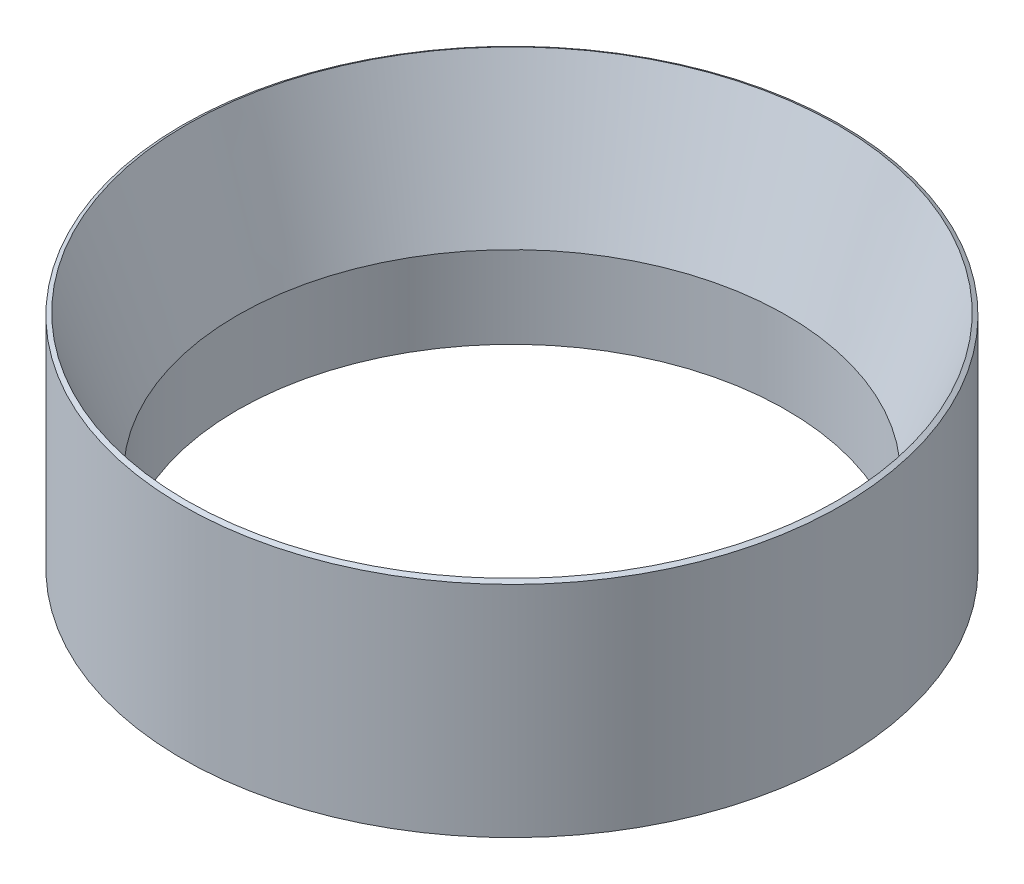
ISO-10303-21;
HEADER;
FILE_DESCRIPTION(('STEP AP214'),'2;1');
FILE_NAME('part.step','',(''),(''),'','','');
FILE_SCHEMA(('AUTOMOTIVE_DESIGN { 1 0 10303 214 1 1 1 1 }'));
ENDSEC;
DATA;
#1=APPLICATION_CONTEXT('core data for automotive mechanical design processes');
#2=APPLICATION_PROTOCOL_DEFINITION('international standard','automotive_design',2000,#1);
#3=PRODUCT_CONTEXT('',#1,'mechanical');
#4=PRODUCT('Part','Part','',(#3));
#5=PRODUCT_RELATED_PRODUCT_CATEGORY('part','',(#4));
#6=PRODUCT_DEFINITION_FORMATION('','',#4);
#7=PRODUCT_DEFINITION_CONTEXT('part definition',#1,'design');
#8=PRODUCT_DEFINITION('design','',#6,#7);
#9=PRODUCT_DEFINITION_SHAPE('','',#8);
#10=(LENGTH_UNIT() NAMED_UNIT(*) SI_UNIT(.MILLI.,.METRE.));
#11=(NAMED_UNIT(*) PLANE_ANGLE_UNIT() SI_UNIT($,.RADIAN.));
#12=(NAMED_UNIT(*) SI_UNIT($,.STERADIAN.) SOLID_ANGLE_UNIT());
#13=UNCERTAINTY_MEASURE_WITH_UNIT(LENGTH_MEASURE(1.E-05),#10,'distance_accuracy_value','');
#14=(GEOMETRIC_REPRESENTATION_CONTEXT(3) GLOBAL_UNCERTAINTY_ASSIGNED_CONTEXT((#13)) GLOBAL_UNIT_ASSIGNED_CONTEXT((#10,
#11,#12)) REPRESENTATION_CONTEXT('',''));
#15=CARTESIAN_POINT('',(0.,0.,0.));
#16=DIRECTION('',(0.,0.,1.));
#17=DIRECTION('',(1.,0.,0.));
#18=AXIS2_PLACEMENT_3D('',#15,#16,#17);
#19=CARTESIAN_POINT('',(0.,12.7,0.));
#20=DIRECTION('',(0.,1.,0.));
#21=DIRECTION('',(-1.,0.,0.));
#22=AXIS2_PLACEMENT_3D('',#19,#20,#21);
#23=CONICAL_SURFACE('',#22,42.545,0.349065850398867);
#24=CARTESIAN_POINT('',(0.,34.3336372007856,0.));
#25=DIRECTION('',(0.,1.,0.));
#26=DIRECTION('',(-1.,0.,0.));
#27=AXIS2_PLACEMENT_3D('',#24,#25,#26);
#28=CIRCLE('',#27,50.419);
#29=CARTESIAN_POINT('',(-50.419,34.3336372007856,0.));
#30=VERTEX_POINT('',#29);
#31=EDGE_CURVE('E58',#30,#30,#28,.T.);
#32=ORIENTED_EDGE('',*,*,#31,.T.);
#33=EDGE_LOOP('',(#32));
#34=FACE_BOUND('',#33,.T.);
#35=CARTESIAN_POINT('',(0.,12.7,0.));
#36=DIRECTION('',(0.,1.,0.));
#37=DIRECTION('',(-1.,0.,0.));
#38=AXIS2_PLACEMENT_3D('',#35,#36,#37);
#39=CIRCLE('',#38,42.545);
#40=CARTESIAN_POINT('',(-42.545,12.7,0.));
#41=VERTEX_POINT('',#40);
#42=EDGE_CURVE('E10',#41,#41,#39,.T.);
#43=ORIENTED_EDGE('',*,*,#42,.F.);
#44=EDGE_LOOP('',(#43));
#45=FACE_BOUND('',#44,.T.);
#46=ADVANCED_FACE('F37',(#34,#45),#23,.F.);
#47=CARTESIAN_POINT('',(0.,36.0782853621393,0.));
#48=DIRECTION('',(0.,1.,0.));
#49=DIRECTION('',(-1.,0.,0.));
#50=AXIS2_PLACEMENT_3D('',#47,#48,#49);
#51=CYLINDRICAL_SURFACE('',#50,42.545);
#52=CARTESIAN_POINT('',(0.,0.,0.));
#53=DIRECTION('',(0.,1.,0.));
#54=DIRECTION('',(-1.,0.,0.));
#55=AXIS2_PLACEMENT_3D('',#52,#53,#54);
#56=CIRCLE('',#55,42.545);
#57=CARTESIAN_POINT('',(-42.545,0.,0.));
#58=VERTEX_POINT('',#57);
#59=EDGE_CURVE('E44',#58,#58,#56,.T.);
#60=ORIENTED_EDGE('',*,*,#59,.F.);
#61=EDGE_LOOP('',(#60));
#62=FACE_BOUND('',#61,.T.);
#63=ORIENTED_EDGE('',*,*,#42,.T.);
#64=EDGE_LOOP('',(#63));
#65=FACE_BOUND('',#64,.T.);
#66=ADVANCED_FACE('F77',(#62,#65),#51,.F.);
#67=CARTESIAN_POINT('',(0.,0.,0.));
#68=DIRECTION('',(0.,-1.,0.));
#69=DIRECTION('',(1.,0.,0.));
#70=AXIS2_PLACEMENT_3D('',#67,#68,#69);
#71=PLANE('',#70);
#72=ORIENTED_EDGE('',*,*,#59,.T.);
#73=EDGE_LOOP('',(#72));
#74=FACE_BOUND('',#73,.T.);
#75=CARTESIAN_POINT('',(0.,0.,0.));
#76=DIRECTION('',(0.,1.,0.));
#77=DIRECTION('',(-1.,0.,0.));
#78=AXIS2_PLACEMENT_3D('',#75,#76,#77);
#79=CIRCLE('',#78,51.054);
#80=CARTESIAN_POINT('',(-51.054,0.,0.));
#81=VERTEX_POINT('',#80);
#82=EDGE_CURVE('E49',#81,#81,#79,.T.);
#83=ORIENTED_EDGE('',*,*,#82,.F.);
#84=EDGE_LOOP('',(#83));
#85=FACE_BOUND('',#84,.T.);
#86=ADVANCED_FACE('F73',(#74,#85),#71,.T.);
#87=CARTESIAN_POINT('',(0.,36.0782853621393,0.));
#88=DIRECTION('',(0.,1.,0.));
#89=DIRECTION('',(-1.,0.,0.));
#90=AXIS2_PLACEMENT_3D('',#87,#88,#89);
#91=CYLINDRICAL_SURFACE('',#90,51.054);
#92=ORIENTED_EDGE('',*,*,#82,.T.);
#93=EDGE_LOOP('',(#92));
#94=FACE_BOUND('',#93,.T.);
#95=CARTESIAN_POINT('',(0.,33.9670197798502,0.));
#96=DIRECTION('',(0.,1.,0.));
#97=DIRECTION('',(-1.,0.,0.));
#98=AXIS2_PLACEMENT_3D('',#95,#96,#97);
#99=CIRCLE('',#98,51.054);
#100=CARTESIAN_POINT('',(-51.054,33.9670197798502,0.));
#101=VERTEX_POINT('',#100);
#102=EDGE_CURVE('E53',#101,#101,#99,.T.);
#103=ORIENTED_EDGE('',*,*,#102,.F.);
#104=EDGE_LOOP('',(#103));
#105=FACE_BOUND('',#104,.T.);
#106=ADVANCED_FACE('F67',(#94,#105),#91,.T.);
#107=CARTESIAN_POINT('',(0.,34.3336372007856,0.));
#108=DIRECTION('',(0.,-1.,0.));
#109=DIRECTION('',(1.,0.,0.));
#110=AXIS2_PLACEMENT_3D('',#107,#108,#109);
#111=CONICAL_SURFACE('',#110,50.419,1.04719755119665);
#112=ORIENTED_EDGE('',*,*,#102,.T.);
#113=EDGE_LOOP('',(#112));
#114=FACE_BOUND('',#113,.T.);
#115=ORIENTED_EDGE('',*,*,#31,.F.);
#116=EDGE_LOOP('',(#115));
#117=FACE_BOUND('',#116,.T.);
#118=ADVANCED_FACE('F65',(#114,#117),#111,.T.);
#119=CLOSED_SHELL('',(#46,#66,#86,#106,#118));
#120=MANIFOLD_SOLID_BREP('B2',#119);
#121=ADVANCED_BREP_SHAPE_REPRESENTATION('',(#18,#120),#14);
#122=SHAPE_DEFINITION_REPRESENTATION(#9,#121);
ENDSEC;
END-ISO-10303-21;
